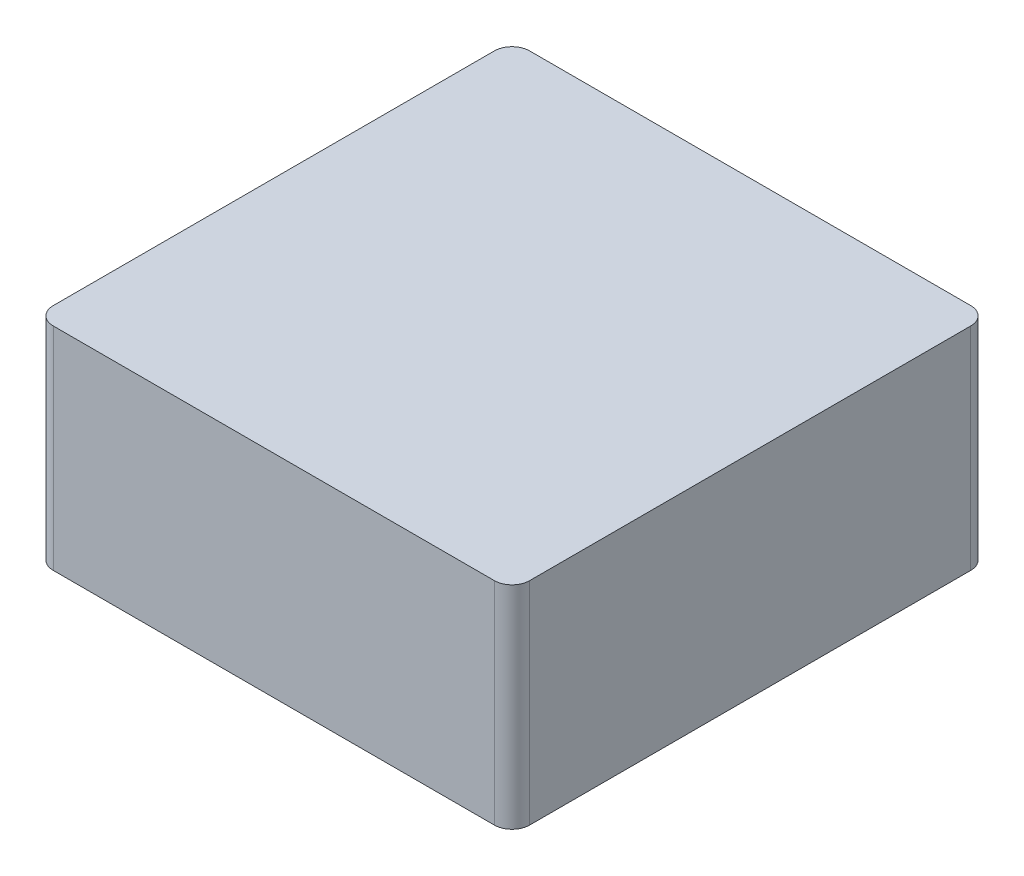
ISO-10303-21;
HEADER;
FILE_DESCRIPTION(('STEP AP214'),'2;1');
FILE_NAME('part.step','',(''),(''),'','','');
FILE_SCHEMA(('AUTOMOTIVE_DESIGN { 1 0 10303 214 1 1 1 1 }'));
ENDSEC;
DATA;
#1=APPLICATION_CONTEXT('core data for automotive mechanical design processes');
#2=APPLICATION_PROTOCOL_DEFINITION('international standard','automotive_design',2000,#1);
#3=PRODUCT_CONTEXT('',#1,'mechanical');
#4=PRODUCT('Part','Part','',(#3));
#5=PRODUCT_RELATED_PRODUCT_CATEGORY('part','',(#4));
#6=PRODUCT_DEFINITION_FORMATION('','',#4);
#7=PRODUCT_DEFINITION_CONTEXT('part definition',#1,'design');
#8=PRODUCT_DEFINITION('design','',#6,#7);
#9=PRODUCT_DEFINITION_SHAPE('','',#8);
#10=(LENGTH_UNIT() NAMED_UNIT(*) SI_UNIT(.MILLI.,.METRE.));
#11=(NAMED_UNIT(*) PLANE_ANGLE_UNIT() SI_UNIT($,.RADIAN.));
#12=(NAMED_UNIT(*) SI_UNIT($,.STERADIAN.) SOLID_ANGLE_UNIT());
#13=UNCERTAINTY_MEASURE_WITH_UNIT(LENGTH_MEASURE(1.E-05),#10,'distance_accuracy_value','');
#14=(GEOMETRIC_REPRESENTATION_CONTEXT(3) GLOBAL_UNCERTAINTY_ASSIGNED_CONTEXT((#13)) GLOBAL_UNIT_ASSIGNED_CONTEXT((#10,
#11,#12)) REPRESENTATION_CONTEXT('',''));
#15=CARTESIAN_POINT('',(0.,0.,0.));
#16=DIRECTION('',(0.,0.,1.));
#17=DIRECTION('',(1.,0.,0.));
#18=AXIS2_PLACEMENT_3D('',#15,#16,#17);
#19=CARTESIAN_POINT('',(27.,24.,-27.));
#20=DIRECTION('',(-1.,0.,0.));
#21=DIRECTION('',(0.,0.,1.));
#22=AXIS2_PLACEMENT_3D('',#19,#20,#21);
#23=PLANE('',#22);
#24=DIRECTION('',(0.,0.,-1.));
#25=VECTOR('',#24,1.);
#26=CARTESIAN_POINT('',(27.,0.,-27.));
#27=LINE('',#26,#25);
#28=CARTESIAN_POINT('',(27.,0.,25.));
#29=VERTEX_POINT('',#28);
#30=CARTESIAN_POINT('',(27.,0.,-25.));
#31=VERTEX_POINT('',#30);
#32=EDGE_CURVE('E215',#29,#31,#27,.T.);
#33=ORIENTED_EDGE('',*,*,#32,.T.);
#34=DIRECTION('',(0.,-1.,0.));
#35=VECTOR('',#34,1.);
#36=CARTESIAN_POINT('',(27.,24.,-25.));
#37=LINE('',#36,#35);
#38=CARTESIAN_POINT('',(27.,24.,-25.));
#39=VERTEX_POINT('',#38);
#40=EDGE_CURVE('E60',#31,#39,#37,.F.);
#41=ORIENTED_EDGE('',*,*,#40,.T.);
#42=DIRECTION('',(0.,0.,-1.));
#43=VECTOR('',#42,1.);
#44=CARTESIAN_POINT('',(27.,24.,-27.));
#45=LINE('',#44,#43);
#46=CARTESIAN_POINT('',(27.,24.,25.));
#47=VERTEX_POINT('',#46);
#48=EDGE_CURVE('E227',#47,#39,#45,.T.);
#49=ORIENTED_EDGE('',*,*,#48,.F.);
#50=DIRECTION('',(0.,-1.,0.));
#51=VECTOR('',#50,1.);
#52=CARTESIAN_POINT('',(27.,24.,25.));
#53=LINE('',#52,#51);
#54=EDGE_CURVE('E266',#47,#29,#53,.T.);
#55=ORIENTED_EDGE('',*,*,#54,.T.);
#56=EDGE_LOOP('',(#33,#41,#49,#55));
#57=FACE_BOUND('',#56,.T.);
#58=ADVANCED_FACE('F37',(#57),#23,.F.);
#59=CARTESIAN_POINT('',(-27.,24.,-27.));
#60=DIRECTION('',(0.,0.,1.));
#61=DIRECTION('',(1.,0.,0.));
#62=AXIS2_PLACEMENT_3D('',#59,#60,#61);
#63=PLANE('',#62);
#64=DIRECTION('',(-1.,0.,0.));
#65=VECTOR('',#64,1.);
#66=CARTESIAN_POINT('',(-27.,24.,-27.));
#67=LINE('',#66,#65);
#68=CARTESIAN_POINT('',(25.,24.,-27.));
#69=VERTEX_POINT('',#68);
#70=CARTESIAN_POINT('',(-25.,24.,-27.));
#71=VERTEX_POINT('',#70);
#72=EDGE_CURVE('E229',#69,#71,#67,.T.);
#73=ORIENTED_EDGE('',*,*,#72,.F.);
#74=DIRECTION('',(0.,-1.,0.));
#75=VECTOR('',#74,1.);
#76=CARTESIAN_POINT('',(25.,24.,-27.));
#77=LINE('',#76,#75);
#78=CARTESIAN_POINT('',(25.,0.,-27.));
#79=VERTEX_POINT('',#78);
#80=EDGE_CURVE('E275',#69,#79,#77,.T.);
#81=ORIENTED_EDGE('',*,*,#80,.T.);
#82=DIRECTION('',(-1.,0.,0.));
#83=VECTOR('',#82,1.);
#84=CARTESIAN_POINT('',(-27.,0.,-27.));
#85=LINE('',#84,#83);
#86=CARTESIAN_POINT('',(-25.,0.,-27.));
#87=VERTEX_POINT('',#86);
#88=EDGE_CURVE('E239',#79,#87,#85,.T.);
#89=ORIENTED_EDGE('',*,*,#88,.T.);
#90=DIRECTION('',(0.,-1.,0.));
#91=VECTOR('',#90,1.);
#92=CARTESIAN_POINT('',(-25.,24.,-27.));
#93=LINE('',#92,#91);
#94=EDGE_CURVE('E261',#87,#71,#93,.F.);
#95=ORIENTED_EDGE('',*,*,#94,.T.);
#96=EDGE_LOOP('',(#73,#81,#89,#95));
#97=FACE_BOUND('',#96,.T.);
#98=ADVANCED_FACE('F320',(#97),#63,.F.);
#99=CARTESIAN_POINT('',(-27.,24.,-27.));
#100=DIRECTION('',(1.,0.,0.));
#101=DIRECTION('',(0.,0.,-1.));
#102=AXIS2_PLACEMENT_3D('',#99,#100,#101);
#103=PLANE('',#102);
#104=DIRECTION('',(0.,0.,1.));
#105=VECTOR('',#104,1.);
#106=CARTESIAN_POINT('',(-27.,24.,-27.));
#107=LINE('',#106,#105);
#108=CARTESIAN_POINT('',(-27.,24.,-25.));
#109=VERTEX_POINT('',#108);
#110=CARTESIAN_POINT('',(-27.,24.,25.));
#111=VERTEX_POINT('',#110);
#112=EDGE_CURVE('E232',#109,#111,#107,.T.);
#113=ORIENTED_EDGE('',*,*,#112,.F.);
#114=DIRECTION('',(0.,-1.,0.));
#115=VECTOR('',#114,1.);
#116=CARTESIAN_POINT('',(-27.,24.,-25.));
#117=LINE('',#116,#115);
#118=CARTESIAN_POINT('',(-27.,0.,-25.));
#119=VERTEX_POINT('',#118);
#120=EDGE_CURVE('E255',#109,#119,#117,.T.);
#121=ORIENTED_EDGE('',*,*,#120,.T.);
#122=DIRECTION('',(0.,0.,1.));
#123=VECTOR('',#122,1.);
#124=CARTESIAN_POINT('',(-27.,0.,-27.));
#125=LINE('',#124,#123);
#126=CARTESIAN_POINT('',(-27.,0.,25.));
#127=VERTEX_POINT('',#126);
#128=EDGE_CURVE('E241',#119,#127,#125,.T.);
#129=ORIENTED_EDGE('',*,*,#128,.T.);
#130=DIRECTION('',(0.,-1.,0.));
#131=VECTOR('',#130,1.);
#132=CARTESIAN_POINT('',(-27.,24.,25.));
#133=LINE('',#132,#131);
#134=EDGE_CURVE('E250',#127,#111,#133,.F.);
#135=ORIENTED_EDGE('',*,*,#134,.T.);
#136=EDGE_LOOP('',(#113,#121,#129,#135));
#137=FACE_BOUND('',#136,.T.);
#138=ADVANCED_FACE('F325',(#137),#103,.F.);
#139=CARTESIAN_POINT('',(-27.,24.,27.));
#140=DIRECTION('',(0.,0.,-1.));
#141=DIRECTION('',(-1.,0.,0.));
#142=AXIS2_PLACEMENT_3D('',#139,#140,#141);
#143=PLANE('',#142);
#144=DIRECTION('',(1.,0.,0.));
#145=VECTOR('',#144,1.);
#146=CARTESIAN_POINT('',(-27.,0.,27.));
#147=LINE('',#146,#145);
#148=CARTESIAN_POINT('',(-25.,0.,27.));
#149=VERTEX_POINT('',#148);
#150=CARTESIAN_POINT('',(25.,0.,27.));
#151=VERTEX_POINT('',#150);
#152=EDGE_CURVE('E230',#149,#151,#147,.T.);
#153=ORIENTED_EDGE('',*,*,#152,.T.);
#154=DIRECTION('',(0.,-1.,0.));
#155=VECTOR('',#154,1.);
#156=CARTESIAN_POINT('',(25.,24.,27.));
#157=LINE('',#156,#155);
#158=CARTESIAN_POINT('',(25.,24.,27.));
#159=VERTEX_POINT('',#158);
#160=EDGE_CURVE('E271',#151,#159,#157,.F.);
#161=ORIENTED_EDGE('',*,*,#160,.T.);
#162=DIRECTION('',(1.,0.,0.));
#163=VECTOR('',#162,1.);
#164=CARTESIAN_POINT('',(-27.,24.,27.));
#165=LINE('',#164,#163);
#166=CARTESIAN_POINT('',(-25.,24.,27.));
#167=VERTEX_POINT('',#166);
#168=EDGE_CURVE('E234',#167,#159,#165,.T.);
#169=ORIENTED_EDGE('',*,*,#168,.F.);
#170=DIRECTION('',(0.,-1.,0.));
#171=VECTOR('',#170,1.);
#172=CARTESIAN_POINT('',(-25.,24.,27.));
#173=LINE('',#172,#171);
#174=EDGE_CURVE('E237',#167,#149,#173,.T.);
#175=ORIENTED_EDGE('',*,*,#174,.T.);
#176=EDGE_LOOP('',(#153,#161,#169,#175));
#177=FACE_BOUND('',#176,.T.);
#178=ADVANCED_FACE('F368',(#177),#143,.F.);
#179=CARTESIAN_POINT('',(0.,24.,0.));
#180=DIRECTION('',(0.,1.,0.));
#181=DIRECTION('',(0.,0.,1.));
#182=AXIS2_PLACEMENT_3D('',#179,#180,#181);
#183=PLANE('',#182);
#184=ORIENTED_EDGE('',*,*,#48,.T.);
#185=CARTESIAN_POINT('',(25.,24.,-25.));
#186=DIRECTION('',(0.,1.,0.));
#187=DIRECTION('',(0.,0.,1.));
#188=AXIS2_PLACEMENT_3D('',#185,#186,#187);
#189=CIRCLE('',#188,2.);
#190=EDGE_CURVE('E281',#39,#69,#189,.T.);
#191=ORIENTED_EDGE('',*,*,#190,.T.);
#192=ORIENTED_EDGE('',*,*,#72,.T.);
#193=CARTESIAN_POINT('',(-25.,24.,-25.));
#194=DIRECTION('',(0.,1.,0.));
#195=DIRECTION('',(0.,0.,1.));
#196=AXIS2_PLACEMENT_3D('',#193,#194,#195);
#197=CIRCLE('',#196,2.);
#198=EDGE_CURVE('E264',#71,#109,#197,.T.);
#199=ORIENTED_EDGE('',*,*,#198,.T.);
#200=ORIENTED_EDGE('',*,*,#112,.T.);
#201=CARTESIAN_POINT('',(-25.,24.,25.));
#202=DIRECTION('',(0.,1.,0.));
#203=DIRECTION('',(0.,0.,1.));
#204=AXIS2_PLACEMENT_3D('',#201,#202,#203);
#205=CIRCLE('',#204,2.);
#206=EDGE_CURVE('E253',#111,#167,#205,.T.);
#207=ORIENTED_EDGE('',*,*,#206,.T.);
#208=ORIENTED_EDGE('',*,*,#168,.T.);
#209=CARTESIAN_POINT('',(25.,24.,25.));
#210=DIRECTION('',(0.,1.,0.));
#211=DIRECTION('',(0.,0.,1.));
#212=AXIS2_PLACEMENT_3D('',#209,#210,#211);
#213=CIRCLE('',#212,2.);
#214=EDGE_CURVE('E273',#159,#47,#213,.T.);
#215=ORIENTED_EDGE('',*,*,#214,.T.);
#216=EDGE_LOOP('',(#184,#191,#192,#199,#200,#207,#208,#215));
#217=FACE_BOUND('',#216,.T.);
#218=ADVANCED_FACE('F349',(#217),#183,.T.);
#219=CARTESIAN_POINT('',(0.,0.,0.));
#220=DIRECTION('',(0.,1.,0.));
#221=DIRECTION('',(0.,0.,1.));
#222=AXIS2_PLACEMENT_3D('',#219,#220,#221);
#223=PLANE('',#222);
#224=CARTESIAN_POINT('',(-25.,0.,25.));
#225=DIRECTION('',(0.,-1.,0.));
#226=DIRECTION('',(0.,0.,-1.));
#227=AXIS2_PLACEMENT_3D('',#224,#225,#226);
#228=CIRCLE('',#227,0.499999999999997);
#229=CARTESIAN_POINT('',(-25.,0.,25.5));
#230=VERTEX_POINT('',#229);
#231=CARTESIAN_POINT('',(-25.5,0.,25.));
#232=VERTEX_POINT('',#231);
#233=EDGE_CURVE('E196',#230,#232,#228,.T.);
#234=ORIENTED_EDGE('',*,*,#233,.F.);
#235=DIRECTION('',(-1.,0.,0.));
#236=VECTOR('',#235,1.);
#237=CARTESIAN_POINT('',(0.,0.,25.5));
#238=LINE('',#237,#236);
#239=CARTESIAN_POINT('',(25.,0.,25.5));
#240=VERTEX_POINT('',#239);
#241=EDGE_CURVE('E52',#240,#230,#238,.T.);
#242=ORIENTED_EDGE('',*,*,#241,.F.);
#243=CARTESIAN_POINT('',(25.,0.,25.));
#244=DIRECTION('',(0.,-1.,0.));
#245=DIRECTION('',(0.,0.,-1.));
#246=AXIS2_PLACEMENT_3D('',#243,#244,#245);
#247=CIRCLE('',#246,0.499999999999997);
#248=CARTESIAN_POINT('',(25.5,0.,25.));
#249=VERTEX_POINT('',#248);
#250=EDGE_CURVE('E173',#249,#240,#247,.T.);
#251=ORIENTED_EDGE('',*,*,#250,.F.);
#252=DIRECTION('',(0.,0.,1.));
#253=VECTOR('',#252,1.);
#254=CARTESIAN_POINT('',(25.5,0.,0.));
#255=LINE('',#254,#253);
#256=CARTESIAN_POINT('',(25.5,0.,-25.));
#257=VERTEX_POINT('',#256);
#258=EDGE_CURVE('E176',#257,#249,#255,.T.);
#259=ORIENTED_EDGE('',*,*,#258,.F.);
#260=CARTESIAN_POINT('',(25.,0.,-25.));
#261=DIRECTION('',(0.,-1.,0.));
#262=DIRECTION('',(0.,0.,-1.));
#263=AXIS2_PLACEMENT_3D('',#260,#261,#262);
#264=CIRCLE('',#263,0.499999999999995);
#265=CARTESIAN_POINT('',(25.,0.,-25.5));
#266=VERTEX_POINT('',#265);
#267=EDGE_CURVE('E208',#266,#257,#264,.T.);
#268=ORIENTED_EDGE('',*,*,#267,.F.);
#269=DIRECTION('',(1.,0.,0.));
#270=VECTOR('',#269,1.);
#271=CARTESIAN_POINT('',(0.,0.,-25.5));
#272=LINE('',#271,#270);
#273=CARTESIAN_POINT('',(-25.,0.,-25.5));
#274=VERTEX_POINT('',#273);
#275=EDGE_CURVE('E205',#274,#266,#272,.T.);
#276=ORIENTED_EDGE('',*,*,#275,.F.);
#277=CARTESIAN_POINT('',(-25.,0.,-25.));
#278=DIRECTION('',(0.,-1.,0.));
#279=DIRECTION('',(0.,0.,-1.));
#280=AXIS2_PLACEMENT_3D('',#277,#278,#279);
#281=CIRCLE('',#280,0.499999999999997);
#282=CARTESIAN_POINT('',(-25.5,0.,-25.));
#283=VERTEX_POINT('',#282);
#284=EDGE_CURVE('E202',#283,#274,#281,.T.);
#285=ORIENTED_EDGE('',*,*,#284,.F.);
#286=DIRECTION('',(0.,0.,-1.));
#287=VECTOR('',#286,1.);
#288=CARTESIAN_POINT('',(-25.5,0.,0.));
#289=LINE('',#288,#287);
#290=EDGE_CURVE('E199',#232,#283,#289,.T.);
#291=ORIENTED_EDGE('',*,*,#290,.F.);
#292=EDGE_LOOP('',(#234,#242,#251,#259,#268,#276,#285,#291));
#293=FACE_BOUND('',#292,.T.);
#294=ORIENTED_EDGE('',*,*,#88,.F.);
#295=CARTESIAN_POINT('',(25.,0.,-25.));
#296=DIRECTION('',(0.,1.,0.));
#297=DIRECTION('',(0.,0.,1.));
#298=AXIS2_PLACEMENT_3D('',#295,#296,#297);
#299=CIRCLE('',#298,2.);
#300=EDGE_CURVE('E278',#79,#31,#299,.F.);
#301=ORIENTED_EDGE('',*,*,#300,.T.);
#302=ORIENTED_EDGE('',*,*,#32,.F.);
#303=CARTESIAN_POINT('',(25.,0.,25.));
#304=DIRECTION('',(0.,1.,0.));
#305=DIRECTION('',(0.,0.,1.));
#306=AXIS2_PLACEMENT_3D('',#303,#304,#305);
#307=CIRCLE('',#306,2.);
#308=EDGE_CURVE('E269',#29,#151,#307,.F.);
#309=ORIENTED_EDGE('',*,*,#308,.T.);
#310=ORIENTED_EDGE('',*,*,#152,.F.);
#311=CARTESIAN_POINT('',(-25.,0.,25.));
#312=DIRECTION('',(0.,1.,0.));
#313=DIRECTION('',(0.,0.,1.));
#314=AXIS2_PLACEMENT_3D('',#311,#312,#313);
#315=CIRCLE('',#314,2.);
#316=EDGE_CURVE('E247',#149,#127,#315,.F.);
#317=ORIENTED_EDGE('',*,*,#316,.T.);
#318=ORIENTED_EDGE('',*,*,#128,.F.);
#319=CARTESIAN_POINT('',(-25.,0.,-25.));
#320=DIRECTION('',(0.,1.,0.));
#321=DIRECTION('',(0.,0.,1.));
#322=AXIS2_PLACEMENT_3D('',#319,#320,#321);
#323=CIRCLE('',#322,2.);
#324=EDGE_CURVE('E258',#119,#87,#323,.F.);
#325=ORIENTED_EDGE('',*,*,#324,.T.);
#326=EDGE_LOOP('',(#294,#301,#302,#309,#310,#317,#318,#325));
#327=FACE_BOUND('',#326,.T.);
#328=ADVANCED_FACE('F334',(#293,#327),#223,.F.);
#329=CARTESIAN_POINT('',(-25.,24.,25.));
#330=DIRECTION('',(0.,-1.,0.));
#331=DIRECTION('',(0.,0.,-1.));
#332=AXIS2_PLACEMENT_3D('',#329,#330,#331);
#333=CYLINDRICAL_SURFACE('',#332,2.);
#334=ORIENTED_EDGE('',*,*,#206,.F.);
#335=ORIENTED_EDGE('',*,*,#134,.F.);
#336=ORIENTED_EDGE('',*,*,#316,.F.);
#337=ORIENTED_EDGE('',*,*,#174,.F.);
#338=EDGE_LOOP('',(#334,#335,#336,#337));
#339=FACE_BOUND('',#338,.T.);
#340=ADVANCED_FACE('F330',(#339),#333,.T.);
#341=CARTESIAN_POINT('',(-25.,24.,-25.));
#342=DIRECTION('',(0.,-1.,0.));
#343=DIRECTION('',(0.,0.,-1.));
#344=AXIS2_PLACEMENT_3D('',#341,#342,#343);
#345=CYLINDRICAL_SURFACE('',#344,2.);
#346=ORIENTED_EDGE('',*,*,#198,.F.);
#347=ORIENTED_EDGE('',*,*,#94,.F.);
#348=ORIENTED_EDGE('',*,*,#324,.F.);
#349=ORIENTED_EDGE('',*,*,#120,.F.);
#350=EDGE_LOOP('',(#346,#347,#348,#349));
#351=FACE_BOUND('',#350,.T.);
#352=ADVANCED_FACE('F333',(#351),#345,.T.);
#353=CARTESIAN_POINT('',(25.,24.,25.));
#354=DIRECTION('',(0.,-1.,0.));
#355=DIRECTION('',(0.,0.,-1.));
#356=AXIS2_PLACEMENT_3D('',#353,#354,#355);
#357=CYLINDRICAL_SURFACE('',#356,2.);
#358=ORIENTED_EDGE('',*,*,#214,.F.);
#359=ORIENTED_EDGE('',*,*,#160,.F.);
#360=ORIENTED_EDGE('',*,*,#308,.F.);
#361=ORIENTED_EDGE('',*,*,#54,.F.);
#362=EDGE_LOOP('',(#358,#359,#360,#361));
#363=FACE_BOUND('',#362,.T.);
#364=ADVANCED_FACE('F337',(#363),#357,.T.);
#365=CARTESIAN_POINT('',(25.,24.,-25.));
#366=DIRECTION('',(0.,-1.,0.));
#367=DIRECTION('',(0.,0.,-1.));
#368=AXIS2_PLACEMENT_3D('',#365,#366,#367);
#369=CYLINDRICAL_SURFACE('',#368,2.);
#370=ORIENTED_EDGE('',*,*,#190,.F.);
#371=ORIENTED_EDGE('',*,*,#40,.F.);
#372=ORIENTED_EDGE('',*,*,#300,.F.);
#373=ORIENTED_EDGE('',*,*,#80,.F.);
#374=EDGE_LOOP('',(#370,#371,#372,#373));
#375=FACE_BOUND('',#374,.T.);
#376=ADVANCED_FACE('F39',(#375),#369,.T.);
#377=CARTESIAN_POINT('',(0.,20.,25.5));
#378=DIRECTION('',(0.,0.,1.));
#379=DIRECTION('',(1.,0.,0.));
#380=AXIS2_PLACEMENT_3D('',#377,#378,#379);
#381=PLANE('',#380);
#382=ORIENTED_EDGE('',*,*,#241,.T.);
#383=DIRECTION('',(0.,-1.,0.));
#384=VECTOR('',#383,1.);
#385=CARTESIAN_POINT('',(-25.,20.,25.5));
#386=LINE('',#385,#384);
#387=CARTESIAN_POINT('',(-25.,20.,25.5));
#388=VERTEX_POINT('',#387);
#389=EDGE_CURVE('E150',#388,#230,#386,.T.);
#390=ORIENTED_EDGE('',*,*,#389,.F.);
#391=DIRECTION('',(-1.,0.,0.));
#392=VECTOR('',#391,1.);
#393=CARTESIAN_POINT('',(0.,20.,25.5));
#394=LINE('',#393,#392);
#395=CARTESIAN_POINT('',(25.,20.,25.5));
#396=VERTEX_POINT('',#395);
#397=EDGE_CURVE('E154',#396,#388,#394,.T.);
#398=ORIENTED_EDGE('',*,*,#397,.F.);
#399=DIRECTION('',(0.,-1.,0.));
#400=VECTOR('',#399,1.);
#401=CARTESIAN_POINT('',(25.,20.,25.5));
#402=LINE('',#401,#400);
#403=EDGE_CURVE('E213',#396,#240,#402,.T.);
#404=ORIENTED_EDGE('',*,*,#403,.T.);
#405=EDGE_LOOP('',(#382,#390,#398,#404));
#406=FACE_BOUND('',#405,.T.);
#407=ADVANCED_FACE('F152',(#406),#381,.F.);
#408=CARTESIAN_POINT('',(25.,20.,25.));
#409=DIRECTION('',(0.,-1.,0.));
#410=DIRECTION('',(0.,0.,-1.));
#411=AXIS2_PLACEMENT_3D('',#408,#409,#410);
#412=CYLINDRICAL_SURFACE('',#411,0.499999999999997);
#413=ORIENTED_EDGE('',*,*,#250,.T.);
#414=ORIENTED_EDGE('',*,*,#403,.F.);
#415=CARTESIAN_POINT('',(25.,20.,25.));
#416=DIRECTION('',(0.,-1.,0.));
#417=DIRECTION('',(0.,0.,-1.));
#418=AXIS2_PLACEMENT_3D('',#415,#416,#417);
#419=CIRCLE('',#418,0.499999999999997);
#420=CARTESIAN_POINT('',(25.5,20.,25.));
#421=VERTEX_POINT('',#420);
#422=EDGE_CURVE('E160',#421,#396,#419,.T.);
#423=ORIENTED_EDGE('',*,*,#422,.F.);
#424=DIRECTION('',(0.,-1.,0.));
#425=VECTOR('',#424,1.);
#426=CARTESIAN_POINT('',(25.5,20.,25.));
#427=LINE('',#426,#425);
#428=EDGE_CURVE('E216',#421,#249,#427,.T.);
#429=ORIENTED_EDGE('',*,*,#428,.T.);
#430=EDGE_LOOP('',(#413,#414,#423,#429));
#431=FACE_BOUND('',#430,.T.);
#432=ADVANCED_FACE('F382',(#431),#412,.F.);
#433=CARTESIAN_POINT('',(25.5,20.,0.));
#434=DIRECTION('',(1.,0.,0.));
#435=DIRECTION('',(0.,0.,-1.));
#436=AXIS2_PLACEMENT_3D('',#433,#434,#435);
#437=PLANE('',#436);
#438=ORIENTED_EDGE('',*,*,#258,.T.);
#439=ORIENTED_EDGE('',*,*,#428,.F.);
#440=DIRECTION('',(0.,0.,1.));
#441=VECTOR('',#440,1.);
#442=CARTESIAN_POINT('',(25.5,20.,0.));
#443=LINE('',#442,#441);
#444=CARTESIAN_POINT('',(25.5,20.,-25.));
#445=VERTEX_POINT('',#444);
#446=EDGE_CURVE('E192',#445,#421,#443,.T.);
#447=ORIENTED_EDGE('',*,*,#446,.F.);
#448=DIRECTION('',(0.,-1.,0.));
#449=VECTOR('',#448,1.);
#450=CARTESIAN_POINT('',(25.5,20.,-25.));
#451=LINE('',#450,#449);
#452=EDGE_CURVE('E218',#445,#257,#451,.T.);
#453=ORIENTED_EDGE('',*,*,#452,.T.);
#454=EDGE_LOOP('',(#438,#439,#447,#453));
#455=FACE_BOUND('',#454,.T.);
#456=ADVANCED_FACE('F400',(#455),#437,.F.);
#457=CARTESIAN_POINT('',(25.,20.,-25.));
#458=DIRECTION('',(0.,-1.,0.));
#459=DIRECTION('',(0.,0.,-1.));
#460=AXIS2_PLACEMENT_3D('',#457,#458,#459);
#461=CYLINDRICAL_SURFACE('',#460,0.499999999999995);
#462=ORIENTED_EDGE('',*,*,#267,.T.);
#463=ORIENTED_EDGE('',*,*,#452,.F.);
#464=CARTESIAN_POINT('',(25.,20.,-25.));
#465=DIRECTION('',(0.,-1.,0.));
#466=DIRECTION('',(0.,0.,-1.));
#467=AXIS2_PLACEMENT_3D('',#464,#465,#466);
#468=CIRCLE('',#467,0.499999999999995);
#469=CARTESIAN_POINT('',(25.,20.,-25.5));
#470=VERTEX_POINT('',#469);
#471=EDGE_CURVE('E189',#470,#445,#468,.T.);
#472=ORIENTED_EDGE('',*,*,#471,.F.);
#473=DIRECTION('',(0.,-1.,0.));
#474=VECTOR('',#473,1.);
#475=CARTESIAN_POINT('',(25.,20.,-25.5));
#476=LINE('',#475,#474);
#477=EDGE_CURVE('E220',#470,#266,#476,.T.);
#478=ORIENTED_EDGE('',*,*,#477,.T.);
#479=EDGE_LOOP('',(#462,#463,#472,#478));
#480=FACE_BOUND('',#479,.T.);
#481=ADVANCED_FACE('F396',(#480),#461,.F.);
#482=CARTESIAN_POINT('',(0.,20.,-25.5));
#483=DIRECTION('',(0.,0.,-1.));
#484=DIRECTION('',(-1.,0.,0.));
#485=AXIS2_PLACEMENT_3D('',#482,#483,#484);
#486=PLANE('',#485);
#487=ORIENTED_EDGE('',*,*,#275,.T.);
#488=ORIENTED_EDGE('',*,*,#477,.F.);
#489=DIRECTION('',(1.,0.,0.));
#490=VECTOR('',#489,1.);
#491=CARTESIAN_POINT('',(0.,20.,-25.5));
#492=LINE('',#491,#490);
#493=CARTESIAN_POINT('',(-25.,20.,-25.5));
#494=VERTEX_POINT('',#493);
#495=EDGE_CURVE('E186',#494,#470,#492,.T.);
#496=ORIENTED_EDGE('',*,*,#495,.F.);
#497=DIRECTION('',(0.,-1.,0.));
#498=VECTOR('',#497,1.);
#499=CARTESIAN_POINT('',(-25.,20.,-25.5));
#500=LINE('',#499,#498);
#501=EDGE_CURVE('E222',#494,#274,#500,.T.);
#502=ORIENTED_EDGE('',*,*,#501,.T.);
#503=EDGE_LOOP('',(#487,#488,#496,#502));
#504=FACE_BOUND('',#503,.T.);
#505=ADVANCED_FACE('F392',(#504),#486,.F.);
#506=CARTESIAN_POINT('',(-25.,20.,-25.));
#507=DIRECTION('',(0.,-1.,0.));
#508=DIRECTION('',(0.,0.,-1.));
#509=AXIS2_PLACEMENT_3D('',#506,#507,#508);
#510=CYLINDRICAL_SURFACE('',#509,0.499999999999997);
#511=ORIENTED_EDGE('',*,*,#284,.T.);
#512=ORIENTED_EDGE('',*,*,#501,.F.);
#513=CARTESIAN_POINT('',(-25.,20.,-25.));
#514=DIRECTION('',(0.,-1.,0.));
#515=DIRECTION('',(0.,0.,-1.));
#516=AXIS2_PLACEMENT_3D('',#513,#514,#515);
#517=CIRCLE('',#516,0.499999999999997);
#518=CARTESIAN_POINT('',(-25.5,20.,-25.));
#519=VERTEX_POINT('',#518);
#520=EDGE_CURVE('E183',#519,#494,#517,.T.);
#521=ORIENTED_EDGE('',*,*,#520,.F.);
#522=DIRECTION('',(0.,-1.,0.));
#523=VECTOR('',#522,1.);
#524=CARTESIAN_POINT('',(-25.5,20.,-25.));
#525=LINE('',#524,#523);
#526=EDGE_CURVE('E224',#519,#283,#525,.T.);
#527=ORIENTED_EDGE('',*,*,#526,.T.);
#528=EDGE_LOOP('',(#511,#512,#521,#527));
#529=FACE_BOUND('',#528,.T.);
#530=ADVANCED_FACE('F388',(#529),#510,.F.);
#531=CARTESIAN_POINT('',(-25.5,20.,0.));
#532=DIRECTION('',(-1.,0.,0.));
#533=DIRECTION('',(0.,0.,1.));
#534=AXIS2_PLACEMENT_3D('',#531,#532,#533);
#535=PLANE('',#534);
#536=ORIENTED_EDGE('',*,*,#290,.T.);
#537=ORIENTED_EDGE('',*,*,#526,.F.);
#538=DIRECTION('',(0.,0.,-1.));
#539=VECTOR('',#538,1.);
#540=CARTESIAN_POINT('',(-25.5,20.,0.));
#541=LINE('',#540,#539);
#542=CARTESIAN_POINT('',(-25.5,20.,25.));
#543=VERTEX_POINT('',#542);
#544=EDGE_CURVE('E168',#543,#519,#541,.T.);
#545=ORIENTED_EDGE('',*,*,#544,.F.);
#546=DIRECTION('',(0.,-1.,0.));
#547=VECTOR('',#546,1.);
#548=CARTESIAN_POINT('',(-25.5,20.,25.));
#549=LINE('',#548,#547);
#550=EDGE_CURVE('E159',#543,#232,#549,.T.);
#551=ORIENTED_EDGE('',*,*,#550,.T.);
#552=EDGE_LOOP('',(#536,#537,#545,#551));
#553=FACE_BOUND('',#552,.T.);
#554=ADVANCED_FACE('F385',(#553),#535,.F.);
#555=CARTESIAN_POINT('',(-25.,20.,25.));
#556=DIRECTION('',(0.,-1.,0.));
#557=DIRECTION('',(0.,0.,-1.));
#558=AXIS2_PLACEMENT_3D('',#555,#556,#557);
#559=CYLINDRICAL_SURFACE('',#558,0.499999999999997);
#560=ORIENTED_EDGE('',*,*,#233,.T.);
#561=ORIENTED_EDGE('',*,*,#550,.F.);
#562=CARTESIAN_POINT('',(-25.,20.,25.));
#563=DIRECTION('',(0.,-1.,0.));
#564=DIRECTION('',(0.,0.,-1.));
#565=AXIS2_PLACEMENT_3D('',#562,#563,#564);
#566=CIRCLE('',#565,0.499999999999997);
#567=EDGE_CURVE('E163',#388,#543,#566,.T.);
#568=ORIENTED_EDGE('',*,*,#567,.F.);
#569=ORIENTED_EDGE('',*,*,#389,.T.);
#570=EDGE_LOOP('',(#560,#561,#568,#569));
#571=FACE_BOUND('',#570,.T.);
#572=ADVANCED_FACE('F164',(#571),#559,.F.);
#573=CARTESIAN_POINT('',(0.,20.,0.));
#574=DIRECTION('',(0.,-1.,0.));
#575=DIRECTION('',(0.,0.,-1.));
#576=AXIS2_PLACEMENT_3D('',#573,#574,#575);
#577=PLANE('',#576);
#578=CARTESIAN_POINT('',(-22.15,20.,11.8));
#579=DIRECTION('',(0.,-1.,0.));
#580=DIRECTION('',(0.,0.,-1.));
#581=AXIS2_PLACEMENT_3D('',#578,#579,#580);
#582=CIRCLE('',#581,2.5);
#583=CARTESIAN_POINT('',(-22.15,20.,9.3));
#584=VERTEX_POINT('',#583);
#585=EDGE_CURVE('E11',#584,#584,#582,.T.);
#586=ORIENTED_EDGE('',*,*,#585,.F.);
#587=EDGE_LOOP('',(#586));
#588=FACE_BOUND('',#587,.T.);
#589=CARTESIAN_POINT('',(22.15,20.,11.8));
#590=DIRECTION('',(0.,-1.,0.));
#591=DIRECTION('',(0.,0.,-1.));
#592=AXIS2_PLACEMENT_3D('',#589,#590,#591);
#593=CIRCLE('',#592,2.5);
#594=CARTESIAN_POINT('',(22.15,20.,9.30000000000001));
#595=VERTEX_POINT('',#594);
#596=EDGE_CURVE('E585',#595,#595,#593,.T.);
#597=ORIENTED_EDGE('',*,*,#596,.F.);
#598=EDGE_LOOP('',(#597));
#599=FACE_BOUND('',#598,.T.);
#600=CARTESIAN_POINT('',(-22.15,20.,-22.5));
#601=DIRECTION('',(0.,-1.,0.));
#602=DIRECTION('',(0.,0.,-1.));
#603=AXIS2_PLACEMENT_3D('',#600,#601,#602);
#604=CIRCLE('',#603,2.5);
#605=CARTESIAN_POINT('',(-22.15,20.,-25.));
#606=VERTEX_POINT('',#605);
#607=EDGE_CURVE('E599',#606,#606,#604,.T.);
#608=ORIENTED_EDGE('',*,*,#607,.F.);
#609=EDGE_LOOP('',(#608));
#610=FACE_BOUND('',#609,.T.);
#611=CARTESIAN_POINT('',(22.15,20.,-22.5));
#612=DIRECTION('',(0.,-1.,0.));
#613=DIRECTION('',(0.,0.,-1.));
#614=AXIS2_PLACEMENT_3D('',#611,#612,#613);
#615=CIRCLE('',#614,2.5);
#616=CARTESIAN_POINT('',(22.15,20.,-25.));
#617=VERTEX_POINT('',#616);
#618=EDGE_CURVE('E283',#617,#617,#615,.T.);
#619=ORIENTED_EDGE('',*,*,#618,.F.);
#620=EDGE_LOOP('',(#619));
#621=FACE_BOUND('',#620,.T.);
#622=ORIENTED_EDGE('',*,*,#397,.T.);
#623=ORIENTED_EDGE('',*,*,#567,.T.);
#624=ORIENTED_EDGE('',*,*,#544,.T.);
#625=ORIENTED_EDGE('',*,*,#520,.T.);
#626=ORIENTED_EDGE('',*,*,#495,.T.);
#627=ORIENTED_EDGE('',*,*,#471,.T.);
#628=ORIENTED_EDGE('',*,*,#446,.T.);
#629=ORIENTED_EDGE('',*,*,#422,.T.);
#630=EDGE_LOOP('',(#622,#623,#624,#625,#626,#627,#628,#629));
#631=FACE_BOUND('',#630,.T.);
#632=ADVANCED_FACE('F170',(#588,#599,#610,#621,#631),#577,.T.);
#633=CARTESIAN_POINT('',(22.15,13.6,-22.5));
#634=DIRECTION('',(0.,1.,0.));
#635=DIRECTION('',(0.,0.,1.));
#636=AXIS2_PLACEMENT_3D('',#633,#634,#635);
#637=CYLINDRICAL_SURFACE('',#636,2.5);
#638=CARTESIAN_POINT('',(22.15,13.6,-22.5));
#639=DIRECTION('',(0.,-1.,0.));
#640=DIRECTION('',(0.,0.,-1.));
#641=AXIS2_PLACEMENT_3D('',#638,#639,#640);
#642=CIRCLE('',#641,2.5);
#643=CARTESIAN_POINT('',(22.15,13.6,-25.));
#644=VERTEX_POINT('',#643);
#645=EDGE_CURVE('E609',#644,#644,#642,.F.);
#646=ORIENTED_EDGE('',*,*,#645,.T.);
#647=EDGE_LOOP('',(#646));
#648=FACE_BOUND('',#647,.T.);
#649=ORIENTED_EDGE('',*,*,#618,.T.);
#650=EDGE_LOOP('',(#649));
#651=FACE_BOUND('',#650,.T.);
#652=ADVANCED_FACE('F450',(#648,#651),#637,.T.);
#653=CARTESIAN_POINT('',(22.15,13.6,-22.5));
#654=DIRECTION('',(0.,1.,0.));
#655=DIRECTION('',(0.,0.,1.));
#656=AXIS2_PLACEMENT_3D('',#653,#654,#655);
#657=CYLINDRICAL_SURFACE('',#656,0.750000000000002);
#658=CARTESIAN_POINT('',(22.15,13.6,-22.5));
#659=DIRECTION('',(0.,-1.,0.));
#660=DIRECTION('',(0.,0.,-1.));
#661=AXIS2_PLACEMENT_3D('',#658,#659,#660);
#662=CIRCLE('',#661,0.750000000000002);
#663=CARTESIAN_POINT('',(22.15,13.6,-23.25));
#664=VERTEX_POINT('',#663);
#665=EDGE_CURVE('E197',#664,#664,#662,.F.);
#666=ORIENTED_EDGE('',*,*,#665,.F.);
#667=EDGE_LOOP('',(#666));
#668=FACE_BOUND('',#667,.T.);
#669=CARTESIAN_POINT('',(22.15,20.,-22.5));
#670=DIRECTION('',(0.,-1.,0.));
#671=DIRECTION('',(0.,0.,-1.));
#672=AXIS2_PLACEMENT_3D('',#669,#670,#671);
#673=CIRCLE('',#672,0.750000000000002);
#674=CARTESIAN_POINT('',(22.15,20.,-23.25));
#675=VERTEX_POINT('',#674);
#676=EDGE_CURVE('E179',#675,#675,#673,.F.);
#677=ORIENTED_EDGE('',*,*,#676,.T.);
#678=EDGE_LOOP('',(#677));
#679=FACE_BOUND('',#678,.T.);
#680=ADVANCED_FACE('F457',(#668,#679),#657,.F.);
#681=CARTESIAN_POINT('',(0.,13.6,0.));
#682=DIRECTION('',(0.,-1.,0.));
#683=DIRECTION('',(0.,0.,-1.));
#684=AXIS2_PLACEMENT_3D('',#681,#682,#683);
#685=PLANE('',#684);
#686=ORIENTED_EDGE('',*,*,#645,.F.);
#687=EDGE_LOOP('',(#686));
#688=FACE_BOUND('',#687,.T.);
#689=ORIENTED_EDGE('',*,*,#665,.T.);
#690=EDGE_LOOP('',(#689));
#691=FACE_BOUND('',#690,.T.);
#692=ADVANCED_FACE('F464',(#688,#691),#685,.T.);
#693=ORIENTED_EDGE('',*,*,#676,.F.);
#694=EDGE_LOOP('',(#693));
#695=FACE_BOUND('',#694,.T.);
#696=ADVANCED_FACE('F315',(#695),#577,.T.);
#697=CARTESIAN_POINT('',(-22.15,13.6,-22.5));
#698=DIRECTION('',(0.,1.,0.));
#699=DIRECTION('',(0.,0.,1.));
#700=AXIS2_PLACEMENT_3D('',#697,#698,#699);
#701=CYLINDRICAL_SURFACE('',#700,0.750000000000002);
#702=CARTESIAN_POINT('',(-22.15,13.6,-22.5));
#703=DIRECTION('',(0.,-1.,0.));
#704=DIRECTION('',(0.,0.,-1.));
#705=AXIS2_PLACEMENT_3D('',#702,#703,#704);
#706=CIRCLE('',#705,0.750000000000002);
#707=CARTESIAN_POINT('',(-22.15,13.6,-23.25));
#708=VERTEX_POINT('',#707);
#709=EDGE_CURVE('E601',#708,#708,#706,.T.);
#710=ORIENTED_EDGE('',*,*,#709,.T.);
#711=EDGE_LOOP('',(#710));
#712=FACE_BOUND('',#711,.T.);
#713=CARTESIAN_POINT('',(-22.15,20.,-22.5));
#714=DIRECTION('',(0.,-1.,0.));
#715=DIRECTION('',(0.,0.,-1.));
#716=AXIS2_PLACEMENT_3D('',#713,#714,#715);
#717=CIRCLE('',#716,0.750000000000002);
#718=CARTESIAN_POINT('',(-22.15,20.,-23.25));
#719=VERTEX_POINT('',#718);
#720=EDGE_CURVE('E286',#719,#719,#717,.F.);
#721=ORIENTED_EDGE('',*,*,#720,.T.);
#722=EDGE_LOOP('',(#721));
#723=FACE_BOUND('',#722,.T.);
#724=ADVANCED_FACE('F479',(#712,#723),#701,.F.);
#725=CARTESIAN_POINT('',(-22.15,13.6,-22.5));
#726=DIRECTION('',(0.,1.,0.));
#727=DIRECTION('',(0.,0.,1.));
#728=AXIS2_PLACEMENT_3D('',#725,#726,#727);
#729=CYLINDRICAL_SURFACE('',#728,2.5);
#730=CARTESIAN_POINT('',(-22.15,13.6,-22.5));
#731=DIRECTION('',(0.,-1.,0.));
#732=DIRECTION('',(0.,0.,-1.));
#733=AXIS2_PLACEMENT_3D('',#730,#731,#732);
#734=CIRCLE('',#733,2.5);
#735=CARTESIAN_POINT('',(-22.15,13.6,-25.));
#736=VERTEX_POINT('',#735);
#737=EDGE_CURVE('E604',#736,#736,#734,.T.);
#738=ORIENTED_EDGE('',*,*,#737,.F.);
#739=EDGE_LOOP('',(#738));
#740=FACE_BOUND('',#739,.T.);
#741=ORIENTED_EDGE('',*,*,#607,.T.);
#742=EDGE_LOOP('',(#741));
#743=FACE_BOUND('',#742,.T.);
#744=ADVANCED_FACE('F486',(#740,#743),#729,.T.);
#745=CARTESIAN_POINT('',(0.,13.6,0.));
#746=DIRECTION('',(0.,-1.,0.));
#747=DIRECTION('',(0.,0.,-1.));
#748=AXIS2_PLACEMENT_3D('',#745,#746,#747);
#749=PLANE('',#748);
#750=ORIENTED_EDGE('',*,*,#709,.F.);
#751=EDGE_LOOP('',(#750));
#752=FACE_BOUND('',#751,.T.);
#753=ORIENTED_EDGE('',*,*,#737,.T.);
#754=EDGE_LOOP('',(#753));
#755=FACE_BOUND('',#754,.T.);
#756=ADVANCED_FACE('F313',(#752,#755),#749,.T.);
#757=ORIENTED_EDGE('',*,*,#720,.F.);
#758=EDGE_LOOP('',(#757));
#759=FACE_BOUND('',#758,.T.);
#760=ADVANCED_FACE('F298',(#759),#577,.T.);
#761=CARTESIAN_POINT('',(22.15,13.6,11.8));
#762=DIRECTION('',(0.,1.,0.));
#763=DIRECTION('',(0.,0.,1.));
#764=AXIS2_PLACEMENT_3D('',#761,#762,#763);
#765=CYLINDRICAL_SURFACE('',#764,0.750000000000002);
#766=CARTESIAN_POINT('',(22.15,13.6,11.8));
#767=DIRECTION('',(0.,-1.,0.));
#768=DIRECTION('',(0.,0.,-1.));
#769=AXIS2_PLACEMENT_3D('',#766,#767,#768);
#770=CIRCLE('',#769,0.750000000000002);
#771=CARTESIAN_POINT('',(22.15,13.6,11.05));
#772=VERTEX_POINT('',#771);
#773=EDGE_CURVE('E588',#772,#772,#770,.T.);
#774=ORIENTED_EDGE('',*,*,#773,.T.);
#775=EDGE_LOOP('',(#774));
#776=FACE_BOUND('',#775,.T.);
#777=CARTESIAN_POINT('',(22.15,20.,11.8));
#778=DIRECTION('',(0.,-1.,0.));
#779=DIRECTION('',(0.,0.,-1.));
#780=AXIS2_PLACEMENT_3D('',#777,#778,#779);
#781=CIRCLE('',#780,0.750000000000002);
#782=CARTESIAN_POINT('',(22.15,20.,11.05));
#783=VERTEX_POINT('',#782);
#784=EDGE_CURVE('E45',#783,#783,#781,.F.);
#785=ORIENTED_EDGE('',*,*,#784,.T.);
#786=EDGE_LOOP('',(#785));
#787=FACE_BOUND('',#786,.T.);
#788=ADVANCED_FACE('F291',(#776,#787),#765,.F.);
#789=CARTESIAN_POINT('',(22.15,13.6,11.8));
#790=DIRECTION('',(0.,1.,0.));
#791=DIRECTION('',(0.,0.,1.));
#792=AXIS2_PLACEMENT_3D('',#789,#790,#791);
#793=CYLINDRICAL_SURFACE('',#792,2.5);
#794=CARTESIAN_POINT('',(22.15,13.6,11.8));
#795=DIRECTION('',(0.,-1.,0.));
#796=DIRECTION('',(0.,0.,-1.));
#797=AXIS2_PLACEMENT_3D('',#794,#795,#796);
#798=CIRCLE('',#797,2.5);
#799=CARTESIAN_POINT('',(22.15,13.6,9.30000000000001));
#800=VERTEX_POINT('',#799);
#801=EDGE_CURVE('E597',#800,#800,#798,.T.);
#802=ORIENTED_EDGE('',*,*,#801,.F.);
#803=EDGE_LOOP('',(#802));
#804=FACE_BOUND('',#803,.T.);
#805=ORIENTED_EDGE('',*,*,#596,.T.);
#806=EDGE_LOOP('',(#805));
#807=FACE_BOUND('',#806,.T.);
#808=ADVANCED_FACE('F307',(#804,#807),#793,.T.);
#809=CARTESIAN_POINT('',(0.,13.6,0.));
#810=DIRECTION('',(0.,-1.,0.));
#811=DIRECTION('',(0.,0.,-1.));
#812=AXIS2_PLACEMENT_3D('',#809,#810,#811);
#813=PLANE('',#812);
#814=ORIENTED_EDGE('',*,*,#773,.F.);
#815=EDGE_LOOP('',(#814));
#816=FACE_BOUND('',#815,.T.);
#817=ORIENTED_EDGE('',*,*,#801,.T.);
#818=EDGE_LOOP('',(#817));
#819=FACE_BOUND('',#818,.T.);
#820=ADVANCED_FACE('F296',(#816,#819),#813,.T.);
#821=ORIENTED_EDGE('',*,*,#784,.F.);
#822=EDGE_LOOP('',(#821));
#823=FACE_BOUND('',#822,.T.);
#824=ADVANCED_FACE('F293',(#823),#577,.T.);
#825=CARTESIAN_POINT('',(-22.15,13.6,11.8));
#826=DIRECTION('',(0.,1.,0.));
#827=DIRECTION('',(0.,0.,1.));
#828=AXIS2_PLACEMENT_3D('',#825,#826,#827);
#829=CYLINDRICAL_SURFACE('',#828,2.5);
#830=CARTESIAN_POINT('',(-22.15,13.6,11.8));
#831=DIRECTION('',(0.,-1.,0.));
#832=DIRECTION('',(0.,0.,-1.));
#833=AXIS2_PLACEMENT_3D('',#830,#831,#832);
#834=CIRCLE('',#833,2.5);
#835=CARTESIAN_POINT('',(-22.15,13.6,9.3));
#836=VERTEX_POINT('',#835);
#837=EDGE_CURVE('E581',#836,#836,#834,.F.);
#838=ORIENTED_EDGE('',*,*,#837,.T.);
#839=EDGE_LOOP('',(#838));
#840=FACE_BOUND('',#839,.T.);
#841=ORIENTED_EDGE('',*,*,#585,.T.);
#842=EDGE_LOOP('',(#841));
#843=FACE_BOUND('',#842,.T.);
#844=ADVANCED_FACE('F295',(#840,#843),#829,.T.);
#845=CARTESIAN_POINT('',(-22.15,13.6,11.8));
#846=DIRECTION('',(0.,1.,0.));
#847=DIRECTION('',(0.,0.,1.));
#848=AXIS2_PLACEMENT_3D('',#845,#846,#847);
#849=CYLINDRICAL_SURFACE('',#848,0.750000000000002);
#850=CARTESIAN_POINT('',(-22.15,13.6,11.8));
#851=DIRECTION('',(0.,-1.,0.));
#852=DIRECTION('',(0.,0.,-1.));
#853=AXIS2_PLACEMENT_3D('',#850,#851,#852);
#854=CIRCLE('',#853,0.750000000000002);
#855=CARTESIAN_POINT('',(-22.15,13.6,11.05));
#856=VERTEX_POINT('',#855);
#857=EDGE_CURVE('E584',#856,#856,#854,.F.);
#858=ORIENTED_EDGE('',*,*,#857,.F.);
#859=EDGE_LOOP('',(#858));
#860=FACE_BOUND('',#859,.T.);
#861=CARTESIAN_POINT('',(-22.15,20.,11.8));
#862=DIRECTION('',(0.,-1.,0.));
#863=DIRECTION('',(0.,0.,-1.));
#864=AXIS2_PLACEMENT_3D('',#861,#862,#863);
#865=CIRCLE('',#864,0.750000000000002);
#866=CARTESIAN_POINT('',(-22.15,20.,11.05));
#867=VERTEX_POINT('',#866);
#868=EDGE_CURVE('E590',#867,#867,#865,.F.);
#869=ORIENTED_EDGE('',*,*,#868,.T.);
#870=EDGE_LOOP('',(#869));
#871=FACE_BOUND('',#870,.T.);
#872=ADVANCED_FACE('F304',(#860,#871),#849,.F.);
#873=CARTESIAN_POINT('',(0.,13.6,0.));
#874=DIRECTION('',(0.,-1.,0.));
#875=DIRECTION('',(0.,0.,-1.));
#876=AXIS2_PLACEMENT_3D('',#873,#874,#875);
#877=PLANE('',#876);
#878=ORIENTED_EDGE('',*,*,#837,.F.);
#879=EDGE_LOOP('',(#878));
#880=FACE_BOUND('',#879,.T.);
#881=ORIENTED_EDGE('',*,*,#857,.T.);
#882=EDGE_LOOP('',(#881));
#883=FACE_BOUND('',#882,.T.);
#884=ADVANCED_FACE('F317',(#880,#883),#877,.T.);
#885=ORIENTED_EDGE('',*,*,#868,.F.);
#886=EDGE_LOOP('',(#885));
#887=FACE_BOUND('',#886,.T.);
#888=ADVANCED_FACE('F299',(#887),#577,.T.);
#889=CLOSED_SHELL('',(#58,#98,#138,#178,#218,#328,#340,#352,#364,#376,#407,#432,#456,#481,#505,
#530,#554,#572,#632,#652,#680,#692,#696,#724,#744,#756,#760,#788,#808,#820,#824,#844,#872,#884,#888));
#890=MANIFOLD_SOLID_BREP('B2',#889);
#891=ADVANCED_BREP_SHAPE_REPRESENTATION('',(#18,#890),#14);
#892=SHAPE_DEFINITION_REPRESENTATION(#9,#891);
ENDSEC;
END-ISO-10303-21;
